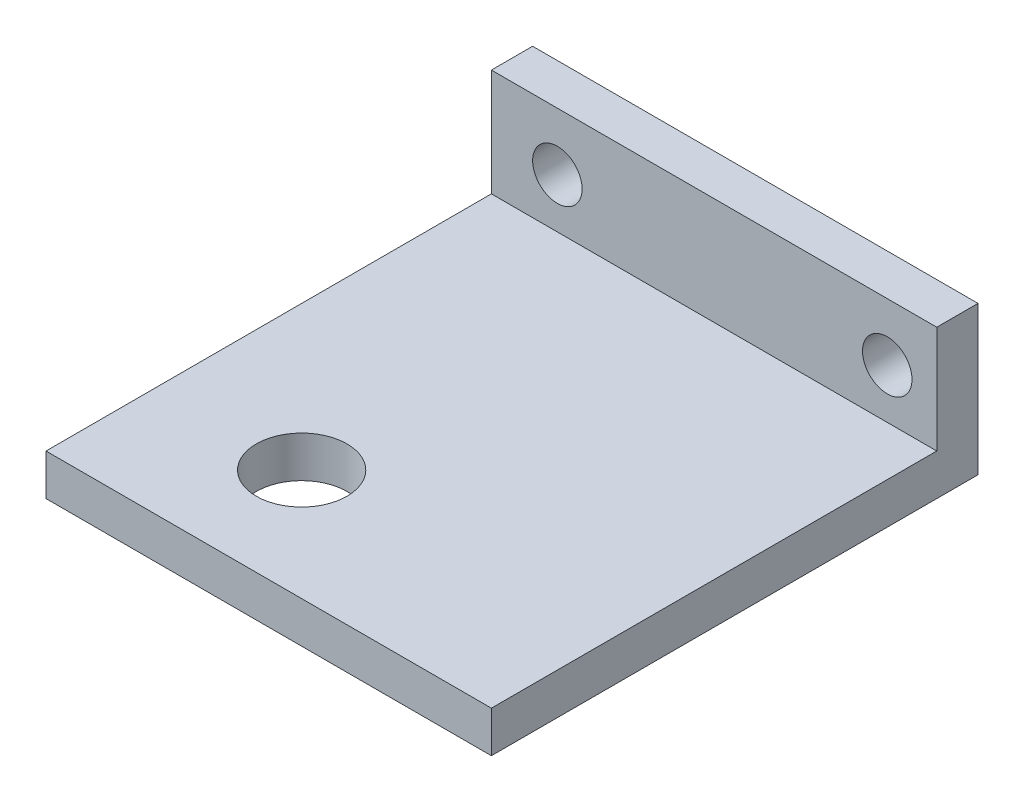
ISO-10303-21;
HEADER;
FILE_DESCRIPTION(('STEP AP214'),'2;1');
FILE_NAME('part.step','',(''),(''),'','','');
FILE_SCHEMA(('AUTOMOTIVE_DESIGN { 1 0 10303 214 1 1 1 1 }'));
ENDSEC;
DATA;
#1=APPLICATION_CONTEXT('core data for automotive mechanical design processes');
#2=APPLICATION_PROTOCOL_DEFINITION('international standard','automotive_design',2000,#1);
#3=PRODUCT_CONTEXT('',#1,'mechanical');
#4=PRODUCT('Part','Part','',(#3));
#5=PRODUCT_RELATED_PRODUCT_CATEGORY('part','',(#4));
#6=PRODUCT_DEFINITION_FORMATION('','',#4);
#7=PRODUCT_DEFINITION_CONTEXT('part definition',#1,'design');
#8=PRODUCT_DEFINITION('design','',#6,#7);
#9=PRODUCT_DEFINITION_SHAPE('','',#8);
#10=(LENGTH_UNIT() NAMED_UNIT(*) SI_UNIT(.MILLI.,.METRE.));
#11=(NAMED_UNIT(*) PLANE_ANGLE_UNIT() SI_UNIT($,.RADIAN.));
#12=(NAMED_UNIT(*) SI_UNIT($,.STERADIAN.) SOLID_ANGLE_UNIT());
#13=UNCERTAINTY_MEASURE_WITH_UNIT(LENGTH_MEASURE(1.E-05),#10,'distance_accuracy_value','');
#14=(GEOMETRIC_REPRESENTATION_CONTEXT(3) GLOBAL_UNCERTAINTY_ASSIGNED_CONTEXT((#13)) GLOBAL_UNIT_ASSIGNED_CONTEXT((#10,
#11,#12)) REPRESENTATION_CONTEXT('',''));
#15=CARTESIAN_POINT('',(0.,0.,0.));
#16=DIRECTION('',(0.,0.,1.));
#17=DIRECTION('',(1.,0.,0.));
#18=AXIS2_PLACEMENT_3D('',#15,#16,#17);
#19=CARTESIAN_POINT('',(0.,0.,59.));
#20=DIRECTION('',(0.,0.,-1.));
#21=DIRECTION('',(-1.,0.,0.));
#22=AXIS2_PLACEMENT_3D('',#19,#20,#21);
#23=PLANE('',#22);
#24=DIRECTION('',(1.,0.,0.));
#25=VECTOR('',#24,1.);
#26=CARTESIAN_POINT('',(0.,-4.,59.));
#27=LINE('',#26,#25);
#28=CARTESIAN_POINT('',(-27.,-4.,59.));
#29=VERTEX_POINT('',#28);
#30=CARTESIAN_POINT('',(27.,-4.,59.));
#31=VERTEX_POINT('',#30);
#32=EDGE_CURVE('E133',#29,#31,#27,.T.);
#33=ORIENTED_EDGE('',*,*,#32,.F.);
#34=DIRECTION('',(0.,-1.,0.));
#35=VECTOR('',#34,1.);
#36=CARTESIAN_POINT('',(-27.,-8.99999999999999,59.));
#37=LINE('',#36,#35);
#38=CARTESIAN_POINT('',(-27.,-8.99999999999999,59.));
#39=VERTEX_POINT('',#38);
#40=EDGE_CURVE('E140',#29,#39,#37,.T.);
#41=ORIENTED_EDGE('',*,*,#40,.T.);
#42=DIRECTION('',(1.,0.,0.));
#43=VECTOR('',#42,1.);
#44=CARTESIAN_POINT('',(-27.,-8.99999999999999,59.));
#45=LINE('',#44,#43);
#46=CARTESIAN_POINT('',(27.,-8.99999999999999,59.));
#47=VERTEX_POINT('',#46);
#48=EDGE_CURVE('E56',#39,#47,#45,.T.);
#49=ORIENTED_EDGE('',*,*,#48,.T.);
#50=DIRECTION('',(0.,1.,0.));
#51=VECTOR('',#50,1.);
#52=CARTESIAN_POINT('',(27.,-8.99999999999999,59.));
#53=LINE('',#52,#51);
#54=EDGE_CURVE('E85',#47,#31,#53,.T.);
#55=ORIENTED_EDGE('',*,*,#54,.T.);
#56=EDGE_LOOP('',(#33,#41,#49,#55));
#57=FACE_BOUND('',#56,.T.);
#58=ADVANCED_FACE('F33',(#57),#23,.F.);
#59=CARTESIAN_POINT('',(0.,0.,0.));
#60=DIRECTION('',(0.,0.,-1.));
#61=DIRECTION('',(-1.,0.,0.));
#62=AXIS2_PLACEMENT_3D('',#59,#60,#61);
#63=PLANE('',#62);
#64=CARTESIAN_POINT('',(-19.,2.,0.));
#65=DIRECTION('',(0.,0.,1.));
#66=DIRECTION('',(1.,0.,0.));
#67=AXIS2_PLACEMENT_3D('',#64,#65,#66);
#68=CIRCLE('',#67,3.);
#69=CARTESIAN_POINT('',(-16.,2.,0.));
#70=VERTEX_POINT('',#69);
#71=EDGE_CURVE('E99',#70,#70,#68,.T.);
#72=ORIENTED_EDGE('',*,*,#71,.T.);
#73=EDGE_LOOP('',(#72));
#74=FACE_BOUND('',#73,.T.);
#75=DIRECTION('',(0.,1.,0.));
#76=VECTOR('',#75,1.);
#77=CARTESIAN_POINT('',(27.,-8.99999999999999,0.));
#78=LINE('',#77,#76);
#79=CARTESIAN_POINT('',(27.,-8.99999999999999,0.));
#80=VERTEX_POINT('',#79);
#81=CARTESIAN_POINT('',(27.,9.,0.));
#82=VERTEX_POINT('',#81);
#83=EDGE_CURVE('E91',#80,#82,#78,.T.);
#84=ORIENTED_EDGE('',*,*,#83,.F.);
#85=DIRECTION('',(1.,0.,0.));
#86=VECTOR('',#85,1.);
#87=CARTESIAN_POINT('',(-27.,-8.99999999999999,0.));
#88=LINE('',#87,#86);
#89=CARTESIAN_POINT('',(-27.,-8.99999999999999,0.));
#90=VERTEX_POINT('',#89);
#91=EDGE_CURVE('E75',#90,#80,#88,.T.);
#92=ORIENTED_EDGE('',*,*,#91,.F.);
#93=DIRECTION('',(0.,-1.,0.));
#94=VECTOR('',#93,1.);
#95=CARTESIAN_POINT('',(-27.,-8.99999999999999,0.));
#96=LINE('',#95,#94);
#97=CARTESIAN_POINT('',(-27.,9.,0.));
#98=VERTEX_POINT('',#97);
#99=EDGE_CURVE('E86',#98,#90,#96,.T.);
#100=ORIENTED_EDGE('',*,*,#99,.F.);
#101=DIRECTION('',(-1.,0.,0.));
#102=VECTOR('',#101,1.);
#103=CARTESIAN_POINT('',(-27.,9.,0.));
#104=LINE('',#103,#102);
#105=EDGE_CURVE('E98',#82,#98,#104,.T.);
#106=ORIENTED_EDGE('',*,*,#105,.F.);
#107=EDGE_LOOP('',(#84,#92,#100,#106));
#108=FACE_BOUND('',#107,.T.);
#109=CARTESIAN_POINT('',(21.,2.,0.));
#110=DIRECTION('',(0.,0.,1.));
#111=DIRECTION('',(1.,0.,0.));
#112=AXIS2_PLACEMENT_3D('',#109,#110,#111);
#113=CIRCLE('',#112,3.);
#114=CARTESIAN_POINT('',(24.,2.,0.));
#115=VERTEX_POINT('',#114);
#116=EDGE_CURVE('E103',#115,#115,#113,.T.);
#117=ORIENTED_EDGE('',*,*,#116,.T.);
#118=EDGE_LOOP('',(#117));
#119=FACE_BOUND('',#118,.T.);
#120=ADVANCED_FACE('F95',(#74,#108,#119),#63,.T.);
#121=CARTESIAN_POINT('',(27.,-8.99999999999999,59.));
#122=DIRECTION('',(-1.,0.,0.));
#123=DIRECTION('',(0.,0.,1.));
#124=AXIS2_PLACEMENT_3D('',#121,#122,#123);
#125=PLANE('',#124);
#126=DIRECTION('',(0.,0.,-1.));
#127=VECTOR('',#126,1.);
#128=CARTESIAN_POINT('',(27.,9.,59.));
#129=LINE('',#128,#127);
#130=CARTESIAN_POINT('',(27.,9.,5.));
#131=VERTEX_POINT('',#130);
#132=EDGE_CURVE('E41',#131,#82,#129,.T.);
#133=ORIENTED_EDGE('',*,*,#132,.F.);
#134=DIRECTION('',(0.,-1.,0.));
#135=VECTOR('',#134,1.);
#136=CARTESIAN_POINT('',(27.,-8.99999999999999,5.));
#137=LINE('',#136,#135);
#138=CARTESIAN_POINT('',(27.,-4.,5.));
#139=VERTEX_POINT('',#138);
#140=EDGE_CURVE('E130',#131,#139,#137,.T.);
#141=ORIENTED_EDGE('',*,*,#140,.T.);
#142=DIRECTION('',(0.,0.,-1.));
#143=VECTOR('',#142,1.);
#144=CARTESIAN_POINT('',(27.,-4.,59.));
#145=LINE('',#144,#143);
#146=EDGE_CURVE('E136',#31,#139,#145,.T.);
#147=ORIENTED_EDGE('',*,*,#146,.F.);
#148=ORIENTED_EDGE('',*,*,#54,.F.);
#149=DIRECTION('',(0.,0.,-1.));
#150=VECTOR('',#149,1.);
#151=CARTESIAN_POINT('',(27.,-8.99999999999999,59.));
#152=LINE('',#151,#150);
#153=EDGE_CURVE('E78',#47,#80,#152,.T.);
#154=ORIENTED_EDGE('',*,*,#153,.T.);
#155=ORIENTED_EDGE('',*,*,#83,.T.);
#156=EDGE_LOOP('',(#133,#141,#147,#148,#154,#155));
#157=FACE_BOUND('',#156,.T.);
#158=ADVANCED_FACE('F35',(#157),#125,.F.);
#159=CARTESIAN_POINT('',(-27.,9.,59.));
#160=DIRECTION('',(0.,-1.,0.));
#161=DIRECTION('',(0.,0.,-1.));
#162=AXIS2_PLACEMENT_3D('',#159,#160,#161);
#163=PLANE('',#162);
#164=DIRECTION('',(0.,0.,-1.));
#165=VECTOR('',#164,1.);
#166=CARTESIAN_POINT('',(-27.,9.,59.));
#167=LINE('',#166,#165);
#168=CARTESIAN_POINT('',(-27.,9.,5.));
#169=VERTEX_POINT('',#168);
#170=EDGE_CURVE('E110',#169,#98,#167,.T.);
#171=ORIENTED_EDGE('',*,*,#170,.F.);
#172=DIRECTION('',(-1.,0.,0.));
#173=VECTOR('',#172,1.);
#174=CARTESIAN_POINT('',(42.5059230736906,9.,5.));
#175=LINE('',#174,#173);
#176=EDGE_CURVE('E120',#131,#169,#175,.T.);
#177=ORIENTED_EDGE('',*,*,#176,.F.);
#178=ORIENTED_EDGE('',*,*,#132,.T.);
#179=ORIENTED_EDGE('',*,*,#105,.T.);
#180=EDGE_LOOP('',(#171,#177,#178,#179));
#181=FACE_BOUND('',#180,.T.);
#182=ADVANCED_FACE('F151',(#181),#163,.F.);
#183=CARTESIAN_POINT('',(-27.,-8.99999999999999,59.));
#184=DIRECTION('',(1.,0.,0.));
#185=DIRECTION('',(0.,0.,-1.));
#186=AXIS2_PLACEMENT_3D('',#183,#184,#185);
#187=PLANE('',#186);
#188=DIRECTION('',(0.,0.,1.));
#189=VECTOR('',#188,1.);
#190=CARTESIAN_POINT('',(-27.,-4.,59.));
#191=LINE('',#190,#189);
#192=CARTESIAN_POINT('',(-27.,-4.,5.));
#193=VERTEX_POINT('',#192);
#194=EDGE_CURVE('E11',#193,#29,#191,.T.);
#195=ORIENTED_EDGE('',*,*,#194,.F.);
#196=DIRECTION('',(0.,1.,0.));
#197=VECTOR('',#196,1.);
#198=CARTESIAN_POINT('',(-27.,-8.99999999999999,5.));
#199=LINE('',#198,#197);
#200=EDGE_CURVE('E118',#193,#169,#199,.T.);
#201=ORIENTED_EDGE('',*,*,#200,.T.);
#202=ORIENTED_EDGE('',*,*,#170,.T.);
#203=ORIENTED_EDGE('',*,*,#99,.T.);
#204=DIRECTION('',(0.,0.,-1.));
#205=VECTOR('',#204,1.);
#206=CARTESIAN_POINT('',(-27.,-8.99999999999999,59.));
#207=LINE('',#206,#205);
#208=EDGE_CURVE('E81',#39,#90,#207,.T.);
#209=ORIENTED_EDGE('',*,*,#208,.F.);
#210=ORIENTED_EDGE('',*,*,#40,.F.);
#211=EDGE_LOOP('',(#195,#201,#202,#203,#209,#210));
#212=FACE_BOUND('',#211,.T.);
#213=ADVANCED_FACE('F146',(#212),#187,.F.);
#214=CARTESIAN_POINT('',(-27.,-8.99999999999999,59.));
#215=DIRECTION('',(0.,1.,0.));
#216=DIRECTION('',(0.,0.,1.));
#217=AXIS2_PLACEMENT_3D('',#214,#215,#216);
#218=PLANE('',#217);
#219=CARTESIAN_POINT('',(-9.49999959916191,-8.99999999999999,45.5022104992939));
#220=DIRECTION('',(0.,1.,0.));
#221=DIRECTION('',(0.,0.,1.));
#222=AXIS2_PLACEMENT_3D('',#219,#220,#221);
#223=CIRCLE('',#222,5.5);
#224=CARTESIAN_POINT('',(-9.49999959916191,-8.99999999999999,51.0022104992939));
#225=VERTEX_POINT('',#224);
#226=EDGE_CURVE('E123',#225,#225,#223,.T.);
#227=ORIENTED_EDGE('',*,*,#226,.T.);
#228=EDGE_LOOP('',(#227));
#229=FACE_BOUND('',#228,.T.);
#230=ORIENTED_EDGE('',*,*,#91,.T.);
#231=ORIENTED_EDGE('',*,*,#153,.F.);
#232=ORIENTED_EDGE('',*,*,#48,.F.);
#233=ORIENTED_EDGE('',*,*,#208,.T.);
#234=EDGE_LOOP('',(#230,#231,#232,#233));
#235=FACE_BOUND('',#234,.T.);
#236=ADVANCED_FACE('F77',(#229,#235),#218,.F.);
#237=CARTESIAN_POINT('',(-19.,2.,59.));
#238=DIRECTION('',(0.,0.,-1.));
#239=DIRECTION('',(-1.,0.,0.));
#240=AXIS2_PLACEMENT_3D('',#237,#238,#239);
#241=CYLINDRICAL_SURFACE('',#240,3.);
#242=CARTESIAN_POINT('',(-19.,2.,5.));
#243=DIRECTION('',(0.,0.,-1.));
#244=DIRECTION('',(-1.,0.,0.));
#245=AXIS2_PLACEMENT_3D('',#242,#243,#244);
#246=CIRCLE('',#245,3.);
#247=CARTESIAN_POINT('',(-22.,2.,5.));
#248=VERTEX_POINT('',#247);
#249=EDGE_CURVE('E114',#248,#248,#246,.T.);
#250=ORIENTED_EDGE('',*,*,#249,.F.);
#251=EDGE_LOOP('',(#250));
#252=FACE_BOUND('',#251,.T.);
#253=ORIENTED_EDGE('',*,*,#71,.F.);
#254=EDGE_LOOP('',(#253));
#255=FACE_BOUND('',#254,.T.);
#256=ADVANCED_FACE('F184',(#252,#255),#241,.F.);
#257=CARTESIAN_POINT('',(21.,2.,59.));
#258=DIRECTION('',(0.,0.,-1.));
#259=DIRECTION('',(-1.,0.,0.));
#260=AXIS2_PLACEMENT_3D('',#257,#258,#259);
#261=CYLINDRICAL_SURFACE('',#260,3.);
#262=CARTESIAN_POINT('',(21.,2.,5.));
#263=DIRECTION('',(0.,0.,-1.));
#264=DIRECTION('',(-1.,0.,0.));
#265=AXIS2_PLACEMENT_3D('',#262,#263,#264);
#266=CIRCLE('',#265,3.);
#267=CARTESIAN_POINT('',(18.,2.,5.));
#268=VERTEX_POINT('',#267);
#269=EDGE_CURVE('E112',#268,#268,#266,.T.);
#270=ORIENTED_EDGE('',*,*,#269,.F.);
#271=EDGE_LOOP('',(#270));
#272=FACE_BOUND('',#271,.T.);
#273=ORIENTED_EDGE('',*,*,#116,.F.);
#274=EDGE_LOOP('',(#273));
#275=FACE_BOUND('',#274,.T.);
#276=ADVANCED_FACE('F172',(#272,#275),#261,.F.);
#277=CARTESIAN_POINT('',(0.,-4.,0.));
#278=DIRECTION('',(0.,1.,0.));
#279=DIRECTION('',(0.,0.,1.));
#280=AXIS2_PLACEMENT_3D('',#277,#278,#279);
#281=PLANE('',#280);
#282=CARTESIAN_POINT('',(-9.49999959916191,-4.,45.5022104992939));
#283=DIRECTION('',(0.,1.,0.));
#284=DIRECTION('',(0.,0.,1.));
#285=AXIS2_PLACEMENT_3D('',#282,#283,#284);
#286=CIRCLE('',#285,5.5);
#287=CARTESIAN_POINT('',(-9.49999959916191,-4.,51.0022104992939));
#288=VERTEX_POINT('',#287);
#289=EDGE_CURVE('E265',#288,#288,#286,.T.);
#290=ORIENTED_EDGE('',*,*,#289,.F.);
#291=EDGE_LOOP('',(#290));
#292=FACE_BOUND('',#291,.T.);
#293=ORIENTED_EDGE('',*,*,#146,.T.);
#294=DIRECTION('',(-1.,0.,0.));
#295=VECTOR('',#294,1.);
#296=CARTESIAN_POINT('',(42.5059230736906,-4.,5.));
#297=LINE('',#296,#295);
#298=EDGE_CURVE('E47',#139,#193,#297,.T.);
#299=ORIENTED_EDGE('',*,*,#298,.T.);
#300=ORIENTED_EDGE('',*,*,#194,.T.);
#301=ORIENTED_EDGE('',*,*,#32,.T.);
#302=EDGE_LOOP('',(#293,#299,#300,#301));
#303=FACE_BOUND('',#302,.T.);
#304=ADVANCED_FACE('F160',(#292,#303),#281,.T.);
#305=CARTESIAN_POINT('',(42.5059230736906,-4.,5.));
#306=DIRECTION('',(0.,0.,-1.));
#307=DIRECTION('',(-1.,0.,0.));
#308=AXIS2_PLACEMENT_3D('',#305,#306,#307);
#309=PLANE('',#308);
#310=ORIENTED_EDGE('',*,*,#249,.T.);
#311=EDGE_LOOP('',(#310));
#312=FACE_BOUND('',#311,.T.);
#313=ORIENTED_EDGE('',*,*,#269,.T.);
#314=EDGE_LOOP('',(#313));
#315=FACE_BOUND('',#314,.T.);
#316=ORIENTED_EDGE('',*,*,#176,.T.);
#317=ORIENTED_EDGE('',*,*,#200,.F.);
#318=ORIENTED_EDGE('',*,*,#298,.F.);
#319=ORIENTED_EDGE('',*,*,#140,.F.);
#320=EDGE_LOOP('',(#316,#317,#318,#319));
#321=FACE_BOUND('',#320,.T.);
#322=ADVANCED_FACE('F161',(#312,#315,#321),#309,.F.);
#323=CARTESIAN_POINT('',(-9.49999959916191,-4.,45.5022104992939));
#324=DIRECTION('',(0.,1.,0.));
#325=DIRECTION('',(0.,0.,1.));
#326=AXIS2_PLACEMENT_3D('',#323,#324,#325);
#327=CYLINDRICAL_SURFACE('',#326,5.5);
#328=ORIENTED_EDGE('',*,*,#226,.F.);
#329=EDGE_LOOP('',(#328));
#330=FACE_BOUND('',#329,.T.);
#331=ORIENTED_EDGE('',*,*,#289,.T.);
#332=EDGE_LOOP('',(#331));
#333=FACE_BOUND('',#332,.T.);
#334=ADVANCED_FACE('F163',(#330,#333),#327,.F.);
#335=CLOSED_SHELL('',(#58,#120,#158,#182,#213,#236,#256,#276,#304,#322,#334));
#336=MANIFOLD_SOLID_BREP('B2',#335);
#337=ADVANCED_BREP_SHAPE_REPRESENTATION('',(#18,#336),#14);
#338=SHAPE_DEFINITION_REPRESENTATION(#9,#337);
ENDSEC;
END-ISO-10303-21;
